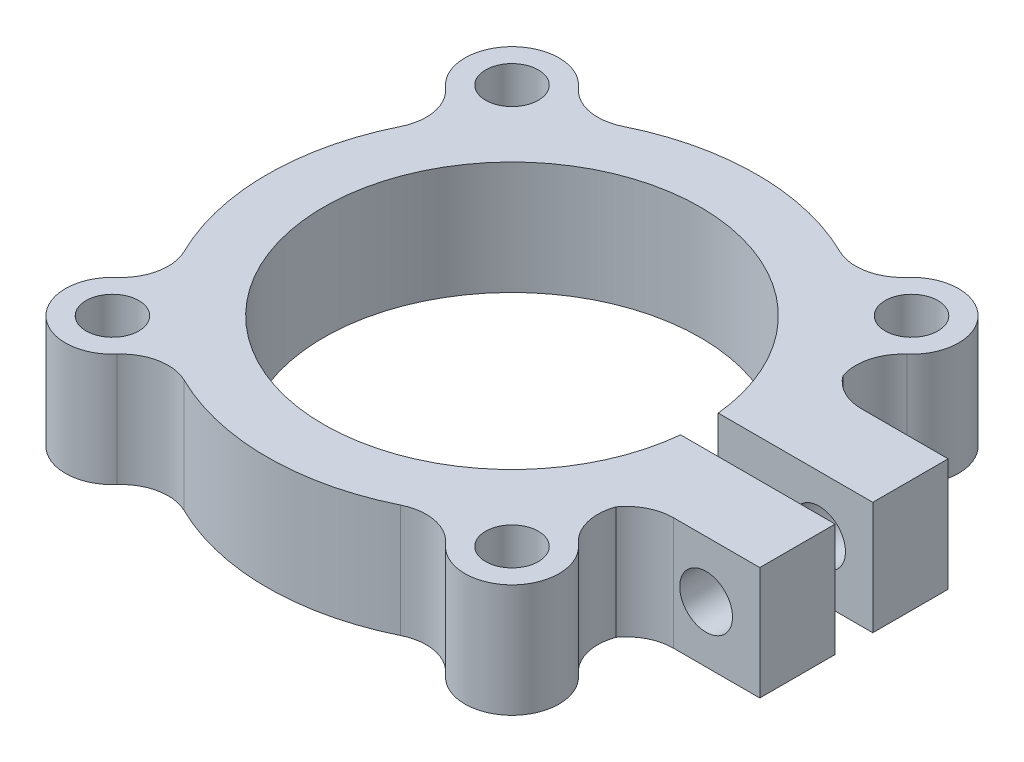
ISO-10303-21;
HEADER;
FILE_DESCRIPTION(('STEP AP214'),'2;1');
FILE_NAME('part.step','',(''),(''),'','','');
FILE_SCHEMA(('AUTOMOTIVE_DESIGN { 1 0 10303 214 1 1 1 1 }'));
ENDSEC;
DATA;
#1=APPLICATION_CONTEXT('core data for automotive mechanical design processes');
#2=APPLICATION_PROTOCOL_DEFINITION('international standard','automotive_design',2000,#1);
#3=PRODUCT_CONTEXT('',#1,'mechanical');
#4=PRODUCT('Part','Part','',(#3));
#5=PRODUCT_RELATED_PRODUCT_CATEGORY('part','',(#4));
#6=PRODUCT_DEFINITION_FORMATION('','',#4);
#7=PRODUCT_DEFINITION_CONTEXT('part definition',#1,'design');
#8=PRODUCT_DEFINITION('design','',#6,#7);
#9=PRODUCT_DEFINITION_SHAPE('','',#8);
#10=(LENGTH_UNIT() NAMED_UNIT(*) SI_UNIT(.MILLI.,.METRE.));
#11=(NAMED_UNIT(*) PLANE_ANGLE_UNIT() SI_UNIT($,.RADIAN.));
#12=(NAMED_UNIT(*) SI_UNIT($,.STERADIAN.) SOLID_ANGLE_UNIT());
#13=UNCERTAINTY_MEASURE_WITH_UNIT(LENGTH_MEASURE(1.E-05),#10,'distance_accuracy_value','');
#14=(GEOMETRIC_REPRESENTATION_CONTEXT(3) GLOBAL_UNCERTAINTY_ASSIGNED_CONTEXT((#13)) GLOBAL_UNIT_ASSIGNED_CONTEXT((#10,
#11,#12)) REPRESENTATION_CONTEXT('',''));
#15=CARTESIAN_POINT('',(0.,0.,0.));
#16=DIRECTION('',(0.,0.,1.));
#17=DIRECTION('',(1.,0.,0.));
#18=AXIS2_PLACEMENT_3D('',#15,#16,#17);
#19=CARTESIAN_POINT('',(23.0579604512541,0.,6.35));
#20=DIRECTION('',(1.,0.,0.));
#21=DIRECTION('',(0.,0.,-1.));
#22=AXIS2_PLACEMENT_3D('',#19,#20,#21);
#23=PLANE('',#22);
#24=DIRECTION('',(0.,-1.,0.));
#25=VECTOR('',#24,1.);
#26=CARTESIAN_POINT('',(23.0579604512541,7.62,-1.27));
#27=LINE('',#26,#25);
#28=CARTESIAN_POINT('',(23.0579604512541,7.62,-1.27));
#29=VERTEX_POINT('',#28);
#30=CARTESIAN_POINT('',(23.0579604512541,0.,-1.27));
#31=VERTEX_POINT('',#30);
#32=EDGE_CURVE('E736',#29,#31,#27,.T.);
#33=ORIENTED_EDGE('',*,*,#32,.T.);
#34=DIRECTION('',(0.,0.,-1.));
#35=VECTOR('',#34,1.);
#36=CARTESIAN_POINT('',(23.0579604512541,0.,6.35));
#37=LINE('',#36,#35);
#38=CARTESIAN_POINT('',(23.0579604512541,0.,-6.35));
#39=VERTEX_POINT('',#38);
#40=EDGE_CURVE('E748',#31,#39,#37,.T.);
#41=ORIENTED_EDGE('',*,*,#40,.T.);
#42=DIRECTION('',(0.,1.,0.));
#43=VECTOR('',#42,1.);
#44=CARTESIAN_POINT('',(23.0579604512541,0.,-6.35));
#45=LINE('',#44,#43);
#46=CARTESIAN_POINT('',(23.0579604512541,7.62,-6.35));
#47=VERTEX_POINT('',#46);
#48=EDGE_CURVE('E309',#39,#47,#45,.T.);
#49=ORIENTED_EDGE('',*,*,#48,.T.);
#50=DIRECTION('',(0.,0.,-1.));
#51=VECTOR('',#50,1.);
#52=CARTESIAN_POINT('',(23.0579604512541,7.62,6.35));
#53=LINE('',#52,#51);
#54=EDGE_CURVE('E222',#29,#47,#53,.T.);
#55=ORIENTED_EDGE('',*,*,#54,.F.);
#56=EDGE_LOOP('',(#33,#41,#49,#55));
#57=FACE_BOUND('',#56,.T.);
#58=ADVANCED_FACE('F34',(#57),#23,.T.);
#59=CARTESIAN_POINT('',(17.2271181571382,0.,6.35));
#60=DIRECTION('',(0.,0.,1.));
#61=DIRECTION('',(1.,0.,0.));
#62=AXIS2_PLACEMENT_3D('',#59,#60,#61);
#63=PLANE('',#62);
#64=CARTESIAN_POINT('',(19.4387931912541,3.81,6.35000000000001));
#65=DIRECTION('',(0.,0.,1.));
#66=DIRECTION('',(1.,0.,0.));
#67=AXIS2_PLACEMENT_3D('',#64,#65,#66);
#68=CIRCLE('',#67,1.77799999999998);
#69=CARTESIAN_POINT('',(21.2167931912541,3.81,6.35000000000001));
#70=VERTEX_POINT('',#69);
#71=EDGE_CURVE('E699',#70,#70,#68,.T.);
#72=ORIENTED_EDGE('',*,*,#71,.F.);
#73=EDGE_LOOP('',(#72));
#74=FACE_BOUND('',#73,.T.);
#75=DIRECTION('',(1.,0.,0.));
#76=VECTOR('',#75,1.);
#77=CARTESIAN_POINT('',(17.2271181571382,7.62,6.35));
#78=LINE('',#77,#76);
#79=CARTESIAN_POINT('',(17.2271181571382,7.62,6.35));
#80=VERTEX_POINT('',#79);
#81=CARTESIAN_POINT('',(23.0579604512541,7.62,6.35));
#82=VERTEX_POINT('',#81);
#83=EDGE_CURVE('E219',#80,#82,#78,.T.);
#84=ORIENTED_EDGE('',*,*,#83,.F.);
#85=DIRECTION('',(0.,1.,0.));
#86=VECTOR('',#85,1.);
#87=CARTESIAN_POINT('',(17.2271181571382,0.,6.35));
#88=LINE('',#87,#86);
#89=CARTESIAN_POINT('',(17.2271181571382,0.,6.35));
#90=VERTEX_POINT('',#89);
#91=EDGE_CURVE('E11',#90,#80,#88,.T.);
#92=ORIENTED_EDGE('',*,*,#91,.F.);
#93=DIRECTION('',(1.,0.,0.));
#94=VECTOR('',#93,1.);
#95=CARTESIAN_POINT('',(17.2271181571382,0.,6.35));
#96=LINE('',#95,#94);
#97=CARTESIAN_POINT('',(23.0579604512541,0.,6.35));
#98=VERTEX_POINT('',#97);
#99=EDGE_CURVE('E277',#90,#98,#96,.T.);
#100=ORIENTED_EDGE('',*,*,#99,.T.);
#101=DIRECTION('',(0.,1.,0.));
#102=VECTOR('',#101,1.);
#103=CARTESIAN_POINT('',(23.0579604512541,0.,6.35));
#104=LINE('',#103,#102);
#105=EDGE_CURVE('E133',#98,#82,#104,.T.);
#106=ORIENTED_EDGE('',*,*,#105,.T.);
#107=EDGE_LOOP('',(#84,#92,#100,#106));
#108=FACE_BOUND('',#107,.T.);
#109=ADVANCED_FACE('F36',(#74,#108),#63,.T.);
#110=CARTESIAN_POINT('',(17.2271181571382,0.,9.525));
#111=DIRECTION('',(0.,1.,0.));
#112=DIRECTION('',(0.,0.,1.));
#113=AXIS2_PLACEMENT_3D('',#110,#111,#112);
#114=CYLINDRICAL_SURFACE('',#113,3.175);
#115=CARTESIAN_POINT('',(17.2271181571382,7.62,9.525));
#116=DIRECTION('',(0.,-1.,0.));
#117=DIRECTION('',(0.,0.,-1.));
#118=AXIS2_PLACEMENT_3D('',#115,#116,#117);
#119=CIRCLE('',#118,3.175);
#120=CARTESIAN_POINT('',(14.6594904855866,7.62,7.65740444949056));
#121=VERTEX_POINT('',#120);
#122=EDGE_CURVE('E275',#121,#80,#119,.T.);
#123=ORIENTED_EDGE('',*,*,#122,.F.);
#124=DIRECTION('',(0.,1.,0.));
#125=VECTOR('',#124,1.);
#126=CARTESIAN_POINT('',(14.6594904855866,0.,7.65740444949056));
#127=LINE('',#126,#125);
#128=CARTESIAN_POINT('',(14.6594904855866,0.,7.65740444949056));
#129=VERTEX_POINT('',#128);
#130=EDGE_CURVE('E43',#129,#121,#127,.T.);
#131=ORIENTED_EDGE('',*,*,#130,.F.);
#132=CARTESIAN_POINT('',(17.2271181571382,0.,9.525));
#133=DIRECTION('',(0.,-1.,0.));
#134=DIRECTION('',(0.,0.,-1.));
#135=AXIS2_PLACEMENT_3D('',#132,#133,#134);
#136=CIRCLE('',#135,3.175);
#137=EDGE_CURVE('E209',#129,#90,#136,.T.);
#138=ORIENTED_EDGE('',*,*,#137,.T.);
#139=ORIENTED_EDGE('',*,*,#91,.T.);
#140=EDGE_LOOP('',(#123,#131,#138,#139));
#141=FACE_BOUND('',#140,.T.);
#142=ADVANCED_FACE('F318',(#141),#114,.F.);
#143=CARTESIAN_POINT('',(17.6591584825056,0.,8.69789323283239));
#144=DIRECTION('',(0.,1.,0.));
#145=DIRECTION('',(0.,0.,1.));
#146=AXIS2_PLACEMENT_3D('',#143,#144,#145);
#147=CYLINDRICAL_SURFACE('',#146,3.175);
#148=CARTESIAN_POINT('',(17.6591584825056,7.62,8.69789323283239));
#149=DIRECTION('',(0.,-1.,0.));
#150=DIRECTION('',(0.,0.,-1.));
#151=AXIS2_PLACEMENT_3D('',#148,#149,#150);
#152=CIRCLE('',#151,3.175);
#153=CARTESIAN_POINT('',(15.5647713320547,7.62,11.0841387072181));
#154=VERTEX_POINT('',#153);
#155=EDGE_CURVE('E195',#154,#121,#152,.T.);
#156=ORIENTED_EDGE('',*,*,#155,.F.);
#157=DIRECTION('',(0.,1.,0.));
#158=VECTOR('',#157,1.);
#159=CARTESIAN_POINT('',(15.5647713320547,0.,11.0841387072181));
#160=LINE('',#159,#158);
#161=CARTESIAN_POINT('',(15.5647713320547,0.,11.0841387072181));
#162=VERTEX_POINT('',#161);
#163=EDGE_CURVE('E189',#162,#154,#160,.T.);
#164=ORIENTED_EDGE('',*,*,#163,.F.);
#165=CARTESIAN_POINT('',(17.6591584825056,0.,8.69789323283239));
#166=DIRECTION('',(0.,-1.,0.));
#167=DIRECTION('',(0.,0.,-1.));
#168=AXIS2_PLACEMENT_3D('',#165,#166,#167);
#169=CIRCLE('',#168,3.175);
#170=EDGE_CURVE('E192',#162,#129,#169,.T.);
#171=ORIENTED_EDGE('',*,*,#170,.T.);
#172=ORIENTED_EDGE('',*,*,#130,.T.);
#173=EDGE_LOOP('',(#156,#164,#171,#172));
#174=FACE_BOUND('',#173,.T.);
#175=ADVANCED_FACE('F191',(#174),#147,.F.);
#176=CARTESIAN_POINT('',(13.4703841816037,0.,13.4703841816037));
#177=DIRECTION('',(0.,1.,0.));
#178=DIRECTION('',(0.,0.,1.));
#179=AXIS2_PLACEMENT_3D('',#176,#177,#178);
#180=CYLINDRICAL_SURFACE('',#179,3.17500000000001);
#181=CARTESIAN_POINT('',(13.4703841816037,7.62,13.4703841816037));
#182=DIRECTION('',(0.,1.,0.));
#183=DIRECTION('',(0.,0.,1.));
#184=AXIS2_PLACEMENT_3D('',#181,#182,#183);
#185=CIRCLE('',#184,3.17500000000001);
#186=CARTESIAN_POINT('',(11.0841387072181,7.62,15.5647713320547));
#187=VERTEX_POINT('',#186);
#188=EDGE_CURVE('E272',#187,#154,#185,.T.);
#189=ORIENTED_EDGE('',*,*,#188,.F.);
#190=DIRECTION('',(0.,1.,0.));
#191=VECTOR('',#190,1.);
#192=CARTESIAN_POINT('',(11.0841387072181,0.,15.5647713320547));
#193=LINE('',#192,#191);
#194=CARTESIAN_POINT('',(11.0841387072181,0.,15.5647713320547));
#195=VERTEX_POINT('',#194);
#196=EDGE_CURVE('E200',#195,#187,#193,.T.);
#197=ORIENTED_EDGE('',*,*,#196,.F.);
#198=CARTESIAN_POINT('',(13.4703841816037,0.,13.4703841816037));
#199=DIRECTION('',(0.,1.,0.));
#200=DIRECTION('',(0.,0.,1.));
#201=AXIS2_PLACEMENT_3D('',#198,#199,#200);
#202=CIRCLE('',#201,3.17500000000001);
#203=EDGE_CURVE('E207',#195,#162,#202,.T.);
#204=ORIENTED_EDGE('',*,*,#203,.T.);
#205=ORIENTED_EDGE('',*,*,#163,.T.);
#206=EDGE_LOOP('',(#189,#197,#204,#205));
#207=FACE_BOUND('',#206,.T.);
#208=ADVANCED_FACE('F211',(#207),#180,.T.);
#209=CARTESIAN_POINT('',(8.69789323283239,0.,17.6591584825056));
#210=DIRECTION('',(0.,1.,0.));
#211=DIRECTION('',(0.,0.,1.));
#212=AXIS2_PLACEMENT_3D('',#209,#210,#211);
#213=CYLINDRICAL_SURFACE('',#212,3.175);
#214=CARTESIAN_POINT('',(8.69789323283239,7.62,17.6591584825056));
#215=DIRECTION('',(0.,-1.,0.));
#216=DIRECTION('',(0.,0.,-1.));
#217=AXIS2_PLACEMENT_3D('',#214,#215,#216);
#218=CIRCLE('',#217,3.175);
#219=CARTESIAN_POINT('',(7.29500722753684,7.62,14.8109071143595));
#220=VERTEX_POINT('',#219);
#221=EDGE_CURVE('E269',#220,#187,#218,.T.);
#222=ORIENTED_EDGE('',*,*,#221,.F.);
#223=DIRECTION('',(0.,1.,0.));
#224=VECTOR('',#223,1.);
#225=CARTESIAN_POINT('',(7.29500722753684,0.,14.8109071143595));
#226=LINE('',#225,#224);
#227=CARTESIAN_POINT('',(7.29500722753684,0.,14.8109071143595));
#228=VERTEX_POINT('',#227);
#229=EDGE_CURVE('E281',#228,#220,#226,.T.);
#230=ORIENTED_EDGE('',*,*,#229,.F.);
#231=CARTESIAN_POINT('',(8.69789323283239,0.,17.6591584825056));
#232=DIRECTION('',(0.,-1.,0.));
#233=DIRECTION('',(0.,0.,-1.));
#234=AXIS2_PLACEMENT_3D('',#231,#232,#233);
#235=CIRCLE('',#234,3.175);
#236=EDGE_CURVE('E212',#228,#195,#235,.T.);
#237=ORIENTED_EDGE('',*,*,#236,.T.);
#238=ORIENTED_EDGE('',*,*,#196,.T.);
#239=EDGE_LOOP('',(#222,#230,#237,#238));
#240=FACE_BOUND('',#239,.T.);
#241=ADVANCED_FACE('F399',(#240),#213,.F.);
#242=CARTESIAN_POINT('',(0.,0.,0.));
#243=DIRECTION('',(0.,1.,0.));
#244=DIRECTION('',(0.,0.,1.));
#245=AXIS2_PLACEMENT_3D('',#242,#243,#244);
#246=CYLINDRICAL_SURFACE('',#245,16.51);
#247=CARTESIAN_POINT('',(0.,7.62,0.));
#248=DIRECTION('',(0.,1.,0.));
#249=DIRECTION('',(0.,0.,1.));
#250=AXIS2_PLACEMENT_3D('',#247,#248,#249);
#251=CIRCLE('',#250,16.51);
#252=CARTESIAN_POINT('',(-7.29500722753683,7.62,14.8109071143595));
#253=VERTEX_POINT('',#252);
#254=EDGE_CURVE('E266',#253,#220,#251,.T.);
#255=ORIENTED_EDGE('',*,*,#254,.F.);
#256=DIRECTION('',(0.,1.,0.));
#257=VECTOR('',#256,1.);
#258=CARTESIAN_POINT('',(-7.29500722753683,0.,14.8109071143595));
#259=LINE('',#258,#257);
#260=CARTESIAN_POINT('',(-7.29500722753683,0.,14.8109071143595));
#261=VERTEX_POINT('',#260);
#262=EDGE_CURVE('E283',#261,#253,#259,.T.);
#263=ORIENTED_EDGE('',*,*,#262,.F.);
#264=CARTESIAN_POINT('',(0.,0.,0.));
#265=DIRECTION('',(0.,1.,0.));
#266=DIRECTION('',(0.,0.,1.));
#267=AXIS2_PLACEMENT_3D('',#264,#265,#266);
#268=CIRCLE('',#267,16.51);
#269=EDGE_CURVE('E214',#261,#228,#268,.T.);
#270=ORIENTED_EDGE('',*,*,#269,.T.);
#271=ORIENTED_EDGE('',*,*,#229,.T.);
#272=EDGE_LOOP('',(#255,#263,#270,#271));
#273=FACE_BOUND('',#272,.T.);
#274=ADVANCED_FACE('F395',(#273),#246,.T.);
#275=CARTESIAN_POINT('',(-8.69789323283238,0.,17.6591584825056));
#276=DIRECTION('',(0.,1.,0.));
#277=DIRECTION('',(0.,0.,1.));
#278=AXIS2_PLACEMENT_3D('',#275,#276,#277);
#279=CYLINDRICAL_SURFACE('',#278,3.175);
#280=CARTESIAN_POINT('',(-8.69789323283238,7.62,17.6591584825056));
#281=DIRECTION('',(0.,-1.,0.));
#282=DIRECTION('',(0.,0.,-1.));
#283=AXIS2_PLACEMENT_3D('',#280,#281,#282);
#284=CIRCLE('',#283,3.175);
#285=CARTESIAN_POINT('',(-11.0841387072181,7.62,15.5647713320547));
#286=VERTEX_POINT('',#285);
#287=EDGE_CURVE('E263',#286,#253,#284,.T.);
#288=ORIENTED_EDGE('',*,*,#287,.F.);
#289=DIRECTION('',(0.,1.,0.));
#290=VECTOR('',#289,1.);
#291=CARTESIAN_POINT('',(-11.0841387072181,0.,15.5647713320547));
#292=LINE('',#291,#290);
#293=CARTESIAN_POINT('',(-11.0841387072181,0.,15.5647713320547));
#294=VERTEX_POINT('',#293);
#295=EDGE_CURVE('E285',#294,#286,#292,.T.);
#296=ORIENTED_EDGE('',*,*,#295,.F.);
#297=CARTESIAN_POINT('',(-8.69789323283238,0.,17.6591584825056));
#298=DIRECTION('',(0.,-1.,0.));
#299=DIRECTION('',(0.,0.,-1.));
#300=AXIS2_PLACEMENT_3D('',#297,#298,#299);
#301=CIRCLE('',#300,3.175);
#302=EDGE_CURVE('E787',#294,#261,#301,.T.);
#303=ORIENTED_EDGE('',*,*,#302,.T.);
#304=ORIENTED_EDGE('',*,*,#262,.T.);
#305=EDGE_LOOP('',(#288,#296,#303,#304));
#306=FACE_BOUND('',#305,.T.);
#307=ADVANCED_FACE('F391',(#306),#279,.F.);
#308=CARTESIAN_POINT('',(-13.4703841816037,0.,13.4703841816037));
#309=DIRECTION('',(0.,1.,0.));
#310=DIRECTION('',(0.,0.,1.));
#311=AXIS2_PLACEMENT_3D('',#308,#309,#310);
#312=CYLINDRICAL_SURFACE('',#311,3.17500000000001);
#313=CARTESIAN_POINT('',(-13.4703841816037,7.62,13.4703841816037));
#314=DIRECTION('',(0.,1.,0.));
#315=DIRECTION('',(0.,0.,1.));
#316=AXIS2_PLACEMENT_3D('',#313,#314,#315);
#317=CIRCLE('',#316,3.17500000000001);
#318=CARTESIAN_POINT('',(-15.5647713320547,7.62,11.0841387072181));
#319=VERTEX_POINT('',#318);
#320=EDGE_CURVE('E260',#319,#286,#317,.T.);
#321=ORIENTED_EDGE('',*,*,#320,.F.);
#322=DIRECTION('',(0.,1.,0.));
#323=VECTOR('',#322,1.);
#324=CARTESIAN_POINT('',(-15.5647713320547,0.,11.0841387072181));
#325=LINE('',#324,#323);
#326=CARTESIAN_POINT('',(-15.5647713320547,0.,11.0841387072181));
#327=VERTEX_POINT('',#326);
#328=EDGE_CURVE('E287',#327,#319,#325,.T.);
#329=ORIENTED_EDGE('',*,*,#328,.F.);
#330=CARTESIAN_POINT('',(-13.4703841816037,0.,13.4703841816037));
#331=DIRECTION('',(0.,1.,0.));
#332=DIRECTION('',(0.,0.,1.));
#333=AXIS2_PLACEMENT_3D('',#330,#331,#332);
#334=CIRCLE('',#333,3.17500000000001);
#335=EDGE_CURVE('E784',#327,#294,#334,.T.);
#336=ORIENTED_EDGE('',*,*,#335,.T.);
#337=ORIENTED_EDGE('',*,*,#295,.T.);
#338=EDGE_LOOP('',(#321,#329,#336,#337));
#339=FACE_BOUND('',#338,.T.);
#340=ADVANCED_FACE('F387',(#339),#312,.T.);
#341=CARTESIAN_POINT('',(-17.6591584825056,0.,8.6978932328324));
#342=DIRECTION('',(0.,1.,0.));
#343=DIRECTION('',(0.,0.,1.));
#344=AXIS2_PLACEMENT_3D('',#341,#342,#343);
#345=CYLINDRICAL_SURFACE('',#344,3.175);
#346=CARTESIAN_POINT('',(-17.6591584825056,7.62,8.6978932328324));
#347=DIRECTION('',(0.,-1.,0.));
#348=DIRECTION('',(0.,0.,-1.));
#349=AXIS2_PLACEMENT_3D('',#346,#347,#348);
#350=CIRCLE('',#349,3.175);
#351=CARTESIAN_POINT('',(-14.8109071143595,7.62,7.29500722753685));
#352=VERTEX_POINT('',#351);
#353=EDGE_CURVE('E257',#352,#319,#350,.T.);
#354=ORIENTED_EDGE('',*,*,#353,.F.);
#355=DIRECTION('',(0.,1.,0.));
#356=VECTOR('',#355,1.);
#357=CARTESIAN_POINT('',(-14.8109071143595,0.,7.29500722753685));
#358=LINE('',#357,#356);
#359=CARTESIAN_POINT('',(-14.8109071143595,0.,7.29500722753685));
#360=VERTEX_POINT('',#359);
#361=EDGE_CURVE('E289',#360,#352,#358,.T.);
#362=ORIENTED_EDGE('',*,*,#361,.F.);
#363=CARTESIAN_POINT('',(-17.6591584825056,0.,8.6978932328324));
#364=DIRECTION('',(0.,-1.,0.));
#365=DIRECTION('',(0.,0.,-1.));
#366=AXIS2_PLACEMENT_3D('',#363,#364,#365);
#367=CIRCLE('',#366,3.175);
#368=EDGE_CURVE('E781',#360,#327,#367,.T.);
#369=ORIENTED_EDGE('',*,*,#368,.T.);
#370=ORIENTED_EDGE('',*,*,#328,.T.);
#371=EDGE_LOOP('',(#354,#362,#369,#370));
#372=FACE_BOUND('',#371,.T.);
#373=ADVANCED_FACE('F383',(#372),#345,.F.);
#374=CARTESIAN_POINT('',(0.,0.,0.));
#375=DIRECTION('',(0.,1.,0.));
#376=DIRECTION('',(0.,0.,1.));
#377=AXIS2_PLACEMENT_3D('',#374,#375,#376);
#378=CYLINDRICAL_SURFACE('',#377,16.51);
#379=CARTESIAN_POINT('',(0.,7.62,0.));
#380=DIRECTION('',(0.,1.,0.));
#381=DIRECTION('',(0.,0.,1.));
#382=AXIS2_PLACEMENT_3D('',#379,#380,#381);
#383=CIRCLE('',#382,16.51);
#384=CARTESIAN_POINT('',(-14.8109071143595,7.62,-7.29500722753683));
#385=VERTEX_POINT('',#384);
#386=EDGE_CURVE('E254',#385,#352,#383,.T.);
#387=ORIENTED_EDGE('',*,*,#386,.F.);
#388=DIRECTION('',(0.,1.,0.));
#389=VECTOR('',#388,1.);
#390=CARTESIAN_POINT('',(-14.8109071143595,0.,-7.29500722753683));
#391=LINE('',#390,#389);
#392=CARTESIAN_POINT('',(-14.8109071143595,0.,-7.29500722753683));
#393=VERTEX_POINT('',#392);
#394=EDGE_CURVE('E291',#393,#385,#391,.T.);
#395=ORIENTED_EDGE('',*,*,#394,.F.);
#396=CARTESIAN_POINT('',(0.,0.,0.));
#397=DIRECTION('',(0.,1.,0.));
#398=DIRECTION('',(0.,0.,1.));
#399=AXIS2_PLACEMENT_3D('',#396,#397,#398);
#400=CIRCLE('',#399,16.51);
#401=EDGE_CURVE('E778',#393,#360,#400,.T.);
#402=ORIENTED_EDGE('',*,*,#401,.T.);
#403=ORIENTED_EDGE('',*,*,#361,.T.);
#404=EDGE_LOOP('',(#387,#395,#402,#403));
#405=FACE_BOUND('',#404,.T.);
#406=ADVANCED_FACE('F379',(#405),#378,.T.);
#407=CARTESIAN_POINT('',(-17.6591584825056,0.,-8.69789323283237));
#408=DIRECTION('',(0.,1.,0.));
#409=DIRECTION('',(0.,0.,1.));
#410=AXIS2_PLACEMENT_3D('',#407,#408,#409);
#411=CYLINDRICAL_SURFACE('',#410,3.175);
#412=CARTESIAN_POINT('',(-17.6591584825056,7.62,-8.69789323283237));
#413=DIRECTION('',(0.,-1.,0.));
#414=DIRECTION('',(0.,0.,-1.));
#415=AXIS2_PLACEMENT_3D('',#412,#413,#414);
#416=CIRCLE('',#415,3.175);
#417=CARTESIAN_POINT('',(-15.5647713320547,7.62,-11.084138707218));
#418=VERTEX_POINT('',#417);
#419=EDGE_CURVE('E251',#418,#385,#416,.T.);
#420=ORIENTED_EDGE('',*,*,#419,.F.);
#421=DIRECTION('',(0.,1.,0.));
#422=VECTOR('',#421,1.);
#423=CARTESIAN_POINT('',(-15.5647713320547,0.,-11.084138707218));
#424=LINE('',#423,#422);
#425=CARTESIAN_POINT('',(-15.5647713320547,0.,-11.084138707218));
#426=VERTEX_POINT('',#425);
#427=EDGE_CURVE('E293',#426,#418,#424,.T.);
#428=ORIENTED_EDGE('',*,*,#427,.F.);
#429=CARTESIAN_POINT('',(-17.6591584825056,0.,-8.69789323283237));
#430=DIRECTION('',(0.,-1.,0.));
#431=DIRECTION('',(0.,0.,-1.));
#432=AXIS2_PLACEMENT_3D('',#429,#430,#431);
#433=CIRCLE('',#432,3.175);
#434=EDGE_CURVE('E775',#426,#393,#433,.T.);
#435=ORIENTED_EDGE('',*,*,#434,.T.);
#436=ORIENTED_EDGE('',*,*,#394,.T.);
#437=EDGE_LOOP('',(#420,#428,#435,#436));
#438=FACE_BOUND('',#437,.T.);
#439=ADVANCED_FACE('F375',(#438),#411,.F.);
#440=CARTESIAN_POINT('',(-13.4703841816037,0.,-13.4703841816037));
#441=DIRECTION('',(0.,1.,0.));
#442=DIRECTION('',(0.,0.,1.));
#443=AXIS2_PLACEMENT_3D('',#440,#441,#442);
#444=CYLINDRICAL_SURFACE('',#443,3.17500000000001);
#445=CARTESIAN_POINT('',(-13.4703841816037,7.62,-13.4703841816037));
#446=DIRECTION('',(0.,1.,0.));
#447=DIRECTION('',(0.,0.,1.));
#448=AXIS2_PLACEMENT_3D('',#445,#446,#447);
#449=CIRCLE('',#448,3.17500000000001);
#450=CARTESIAN_POINT('',(-11.0841387072181,7.62,-15.5647713320546));
#451=VERTEX_POINT('',#450);
#452=EDGE_CURVE('E248',#451,#418,#449,.T.);
#453=ORIENTED_EDGE('',*,*,#452,.F.);
#454=DIRECTION('',(0.,1.,0.));
#455=VECTOR('',#454,1.);
#456=CARTESIAN_POINT('',(-11.0841387072181,0.,-15.5647713320546));
#457=LINE('',#456,#455);
#458=CARTESIAN_POINT('',(-11.0841387072181,0.,-15.5647713320546));
#459=VERTEX_POINT('',#458);
#460=EDGE_CURVE('E295',#459,#451,#457,.T.);
#461=ORIENTED_EDGE('',*,*,#460,.F.);
#462=CARTESIAN_POINT('',(-13.4703841816037,0.,-13.4703841816037));
#463=DIRECTION('',(0.,1.,0.));
#464=DIRECTION('',(0.,0.,1.));
#465=AXIS2_PLACEMENT_3D('',#462,#463,#464);
#466=CIRCLE('',#465,3.17500000000001);
#467=EDGE_CURVE('E772',#459,#426,#466,.T.);
#468=ORIENTED_EDGE('',*,*,#467,.T.);
#469=ORIENTED_EDGE('',*,*,#427,.T.);
#470=EDGE_LOOP('',(#453,#461,#468,#469));
#471=FACE_BOUND('',#470,.T.);
#472=ADVANCED_FACE('F371',(#471),#444,.T.);
#473=CARTESIAN_POINT('',(-8.6978932328324,0.,-17.6591584825056));
#474=DIRECTION('',(0.,1.,0.));
#475=DIRECTION('',(0.,0.,1.));
#476=AXIS2_PLACEMENT_3D('',#473,#474,#475);
#477=CYLINDRICAL_SURFACE('',#476,3.175);
#478=CARTESIAN_POINT('',(-8.6978932328324,7.62,-17.6591584825056));
#479=DIRECTION('',(0.,-1.,0.));
#480=DIRECTION('',(0.,0.,-1.));
#481=AXIS2_PLACEMENT_3D('',#478,#479,#480);
#482=CIRCLE('',#481,3.175);
#483=CARTESIAN_POINT('',(-7.29500722753685,7.62,-14.8109071143595));
#484=VERTEX_POINT('',#483);
#485=EDGE_CURVE('E245',#484,#451,#482,.T.);
#486=ORIENTED_EDGE('',*,*,#485,.F.);
#487=DIRECTION('',(0.,1.,0.));
#488=VECTOR('',#487,1.);
#489=CARTESIAN_POINT('',(-7.29500722753685,0.,-14.8109071143595));
#490=LINE('',#489,#488);
#491=CARTESIAN_POINT('',(-7.29500722753685,0.,-14.8109071143595));
#492=VERTEX_POINT('',#491);
#493=EDGE_CURVE('E297',#492,#484,#490,.T.);
#494=ORIENTED_EDGE('',*,*,#493,.F.);
#495=CARTESIAN_POINT('',(-8.6978932328324,0.,-17.6591584825056));
#496=DIRECTION('',(0.,-1.,0.));
#497=DIRECTION('',(0.,0.,-1.));
#498=AXIS2_PLACEMENT_3D('',#495,#496,#497);
#499=CIRCLE('',#498,3.175);
#500=EDGE_CURVE('E769',#492,#459,#499,.T.);
#501=ORIENTED_EDGE('',*,*,#500,.T.);
#502=ORIENTED_EDGE('',*,*,#460,.T.);
#503=EDGE_LOOP('',(#486,#494,#501,#502));
#504=FACE_BOUND('',#503,.T.);
#505=ADVANCED_FACE('F367',(#504),#477,.F.);
#506=CARTESIAN_POINT('',(0.,0.,0.));
#507=DIRECTION('',(0.,1.,0.));
#508=DIRECTION('',(0.,0.,1.));
#509=AXIS2_PLACEMENT_3D('',#506,#507,#508);
#510=CYLINDRICAL_SURFACE('',#509,16.51);
#511=CARTESIAN_POINT('',(0.,7.62,0.));
#512=DIRECTION('',(0.,1.,0.));
#513=DIRECTION('',(0.,0.,1.));
#514=AXIS2_PLACEMENT_3D('',#511,#512,#513);
#515=CIRCLE('',#514,16.51);
#516=CARTESIAN_POINT('',(7.29500722753682,7.62,-14.8109071143595));
#517=VERTEX_POINT('',#516);
#518=EDGE_CURVE('E242',#517,#484,#515,.T.);
#519=ORIENTED_EDGE('',*,*,#518,.F.);
#520=DIRECTION('',(0.,1.,0.));
#521=VECTOR('',#520,1.);
#522=CARTESIAN_POINT('',(7.29500722753682,0.,-14.8109071143595));
#523=LINE('',#522,#521);
#524=CARTESIAN_POINT('',(7.29500722753682,0.,-14.8109071143595));
#525=VERTEX_POINT('',#524);
#526=EDGE_CURVE('E299',#525,#517,#523,.T.);
#527=ORIENTED_EDGE('',*,*,#526,.F.);
#528=CARTESIAN_POINT('',(0.,0.,0.));
#529=DIRECTION('',(0.,1.,0.));
#530=DIRECTION('',(0.,0.,1.));
#531=AXIS2_PLACEMENT_3D('',#528,#529,#530);
#532=CIRCLE('',#531,16.51);
#533=EDGE_CURVE('E766',#525,#492,#532,.T.);
#534=ORIENTED_EDGE('',*,*,#533,.T.);
#535=ORIENTED_EDGE('',*,*,#493,.T.);
#536=EDGE_LOOP('',(#519,#527,#534,#535));
#537=FACE_BOUND('',#536,.T.);
#538=ADVANCED_FACE('F363',(#537),#510,.T.);
#539=CARTESIAN_POINT('',(8.69789323283236,0.,-17.6591584825056));
#540=DIRECTION('',(0.,1.,0.));
#541=DIRECTION('',(0.,0.,1.));
#542=AXIS2_PLACEMENT_3D('',#539,#540,#541);
#543=CYLINDRICAL_SURFACE('',#542,3.175);
#544=CARTESIAN_POINT('',(8.69789323283236,7.62,-17.6591584825056));
#545=DIRECTION('',(0.,-1.,0.));
#546=DIRECTION('',(0.,0.,-1.));
#547=AXIS2_PLACEMENT_3D('',#544,#545,#546);
#548=CIRCLE('',#547,3.175);
#549=CARTESIAN_POINT('',(11.084138707218,7.62,-15.5647713320547));
#550=VERTEX_POINT('',#549);
#551=EDGE_CURVE('E239',#550,#517,#548,.T.);
#552=ORIENTED_EDGE('',*,*,#551,.F.);
#553=DIRECTION('',(0.,1.,0.));
#554=VECTOR('',#553,1.);
#555=CARTESIAN_POINT('',(11.084138707218,0.,-15.5647713320547));
#556=LINE('',#555,#554);
#557=CARTESIAN_POINT('',(11.084138707218,0.,-15.5647713320547));
#558=VERTEX_POINT('',#557);
#559=EDGE_CURVE('E301',#558,#550,#556,.T.);
#560=ORIENTED_EDGE('',*,*,#559,.F.);
#561=CARTESIAN_POINT('',(8.69789323283236,0.,-17.6591584825056));
#562=DIRECTION('',(0.,-1.,0.));
#563=DIRECTION('',(0.,0.,-1.));
#564=AXIS2_PLACEMENT_3D('',#561,#562,#563);
#565=CIRCLE('',#564,3.175);
#566=EDGE_CURVE('E763',#558,#525,#565,.T.);
#567=ORIENTED_EDGE('',*,*,#566,.T.);
#568=ORIENTED_EDGE('',*,*,#526,.T.);
#569=EDGE_LOOP('',(#552,#560,#567,#568));
#570=FACE_BOUND('',#569,.T.);
#571=ADVANCED_FACE('F359',(#570),#543,.F.);
#572=CARTESIAN_POINT('',(13.4703841816037,0.,-13.4703841816038));
#573=DIRECTION('',(0.,1.,0.));
#574=DIRECTION('',(0.,0.,1.));
#575=AXIS2_PLACEMENT_3D('',#572,#573,#574);
#576=CYLINDRICAL_SURFACE('',#575,3.17500000000001);
#577=CARTESIAN_POINT('',(13.4703841816037,7.62,-13.4703841816038));
#578=DIRECTION('',(0.,1.,0.));
#579=DIRECTION('',(0.,0.,1.));
#580=AXIS2_PLACEMENT_3D('',#577,#578,#579);
#581=CIRCLE('',#580,3.17500000000001);
#582=CARTESIAN_POINT('',(15.5647713320546,7.62,-11.0841387072181));
#583=VERTEX_POINT('',#582);
#584=EDGE_CURVE('E236',#583,#550,#581,.T.);
#585=ORIENTED_EDGE('',*,*,#584,.F.);
#586=DIRECTION('',(0.,1.,0.));
#587=VECTOR('',#586,1.);
#588=CARTESIAN_POINT('',(15.5647713320546,0.,-11.0841387072181));
#589=LINE('',#588,#587);
#590=CARTESIAN_POINT('',(15.5647713320546,0.,-11.0841387072181));
#591=VERTEX_POINT('',#590);
#592=EDGE_CURVE('E303',#591,#583,#589,.T.);
#593=ORIENTED_EDGE('',*,*,#592,.F.);
#594=CARTESIAN_POINT('',(13.4703841816037,0.,-13.4703841816038));
#595=DIRECTION('',(0.,1.,0.));
#596=DIRECTION('',(0.,0.,1.));
#597=AXIS2_PLACEMENT_3D('',#594,#595,#596);
#598=CIRCLE('',#597,3.17500000000001);
#599=EDGE_CURVE('E760',#591,#558,#598,.T.);
#600=ORIENTED_EDGE('',*,*,#599,.T.);
#601=ORIENTED_EDGE('',*,*,#559,.T.);
#602=EDGE_LOOP('',(#585,#593,#600,#601));
#603=FACE_BOUND('',#602,.T.);
#604=ADVANCED_FACE('F355',(#603),#576,.T.);
#605=CARTESIAN_POINT('',(17.6591584825056,0.,-8.69789323283242));
#606=DIRECTION('',(0.,1.,0.));
#607=DIRECTION('',(0.,0.,1.));
#608=AXIS2_PLACEMENT_3D('',#605,#606,#607);
#609=CYLINDRICAL_SURFACE('',#608,3.175);
#610=CARTESIAN_POINT('',(17.6591584825056,7.62,-8.69789323283242));
#611=DIRECTION('',(0.,-1.,0.));
#612=DIRECTION('',(0.,0.,-1.));
#613=AXIS2_PLACEMENT_3D('',#610,#611,#612);
#614=CIRCLE('',#613,3.175);
#615=CARTESIAN_POINT('',(14.6594904855866,7.62,-7.65740444949056));
#616=VERTEX_POINT('',#615);
#617=EDGE_CURVE('E233',#616,#583,#614,.T.);
#618=ORIENTED_EDGE('',*,*,#617,.F.);
#619=DIRECTION('',(0.,1.,0.));
#620=VECTOR('',#619,1.);
#621=CARTESIAN_POINT('',(14.6594904855866,0.,-7.65740444949056));
#622=LINE('',#621,#620);
#623=CARTESIAN_POINT('',(14.6594904855866,0.,-7.65740444949056));
#624=VERTEX_POINT('',#623);
#625=EDGE_CURVE('E305',#624,#616,#622,.T.);
#626=ORIENTED_EDGE('',*,*,#625,.F.);
#627=CARTESIAN_POINT('',(17.6591584825056,0.,-8.69789323283242));
#628=DIRECTION('',(0.,-1.,0.));
#629=DIRECTION('',(0.,0.,-1.));
#630=AXIS2_PLACEMENT_3D('',#627,#628,#629);
#631=CIRCLE('',#630,3.175);
#632=EDGE_CURVE('E757',#624,#591,#631,.T.);
#633=ORIENTED_EDGE('',*,*,#632,.T.);
#634=ORIENTED_EDGE('',*,*,#592,.T.);
#635=EDGE_LOOP('',(#618,#626,#633,#634));
#636=FACE_BOUND('',#635,.T.);
#637=ADVANCED_FACE('F347',(#636),#609,.F.);
#638=CARTESIAN_POINT('',(17.2271181571382,0.,-9.525));
#639=DIRECTION('',(0.,1.,0.));
#640=DIRECTION('',(0.,0.,1.));
#641=AXIS2_PLACEMENT_3D('',#638,#639,#640);
#642=CYLINDRICAL_SURFACE('',#641,3.175);
#643=CARTESIAN_POINT('',(17.2271181571382,7.62,-9.525));
#644=DIRECTION('',(0.,-1.,0.));
#645=DIRECTION('',(0.,0.,-1.));
#646=AXIS2_PLACEMENT_3D('',#643,#644,#645);
#647=CIRCLE('',#646,3.175);
#648=CARTESIAN_POINT('',(17.2271181571382,7.62,-6.35));
#649=VERTEX_POINT('',#648);
#650=EDGE_CURVE('E230',#649,#616,#647,.T.);
#651=ORIENTED_EDGE('',*,*,#650,.F.);
#652=DIRECTION('',(0.,1.,0.));
#653=VECTOR('',#652,1.);
#654=CARTESIAN_POINT('',(17.2271181571382,0.,-6.35));
#655=LINE('',#654,#653);
#656=CARTESIAN_POINT('',(17.2271181571382,0.,-6.35));
#657=VERTEX_POINT('',#656);
#658=EDGE_CURVE('E307',#657,#649,#655,.T.);
#659=ORIENTED_EDGE('',*,*,#658,.F.);
#660=CARTESIAN_POINT('',(17.2271181571382,0.,-9.525));
#661=DIRECTION('',(0.,-1.,0.));
#662=DIRECTION('',(0.,0.,-1.));
#663=AXIS2_PLACEMENT_3D('',#660,#661,#662);
#664=CIRCLE('',#663,3.175);
#665=EDGE_CURVE('E754',#657,#624,#664,.T.);
#666=ORIENTED_EDGE('',*,*,#665,.T.);
#667=ORIENTED_EDGE('',*,*,#625,.T.);
#668=EDGE_LOOP('',(#651,#659,#666,#667));
#669=FACE_BOUND('',#668,.T.);
#670=ADVANCED_FACE('F342',(#669),#642,.F.);
#671=CARTESIAN_POINT('',(23.0579604512541,0.,-6.35));
#672=DIRECTION('',(0.,0.,-1.));
#673=DIRECTION('',(-1.,0.,0.));
#674=AXIS2_PLACEMENT_3D('',#671,#672,#673);
#675=PLANE('',#674);
#676=CARTESIAN_POINT('',(19.4387931912541,3.81,-6.35));
#677=DIRECTION('',(0.,0.,-1.));
#678=DIRECTION('',(-1.,0.,0.));
#679=AXIS2_PLACEMENT_3D('',#676,#677,#678);
#680=CIRCLE('',#679,1.77799999999998);
#681=CARTESIAN_POINT('',(17.6607931912541,3.81,-6.35));
#682=VERTEX_POINT('',#681);
#683=EDGE_CURVE('E691',#682,#682,#680,.T.);
#684=ORIENTED_EDGE('',*,*,#683,.F.);
#685=EDGE_LOOP('',(#684));
#686=FACE_BOUND('',#685,.T.);
#687=DIRECTION('',(-1.,0.,0.));
#688=VECTOR('',#687,1.);
#689=CARTESIAN_POINT('',(23.0579604512541,7.62,-6.35));
#690=LINE('',#689,#688);
#691=EDGE_CURVE('E227',#47,#649,#690,.T.);
#692=ORIENTED_EDGE('',*,*,#691,.F.);
#693=ORIENTED_EDGE('',*,*,#48,.F.);
#694=DIRECTION('',(-1.,0.,0.));
#695=VECTOR('',#694,1.);
#696=CARTESIAN_POINT('',(23.0579604512541,0.,-6.35));
#697=LINE('',#696,#695);
#698=EDGE_CURVE('E751',#39,#657,#697,.T.);
#699=ORIENTED_EDGE('',*,*,#698,.T.);
#700=ORIENTED_EDGE('',*,*,#658,.T.);
#701=EDGE_LOOP('',(#692,#693,#699,#700));
#702=FACE_BOUND('',#701,.T.);
#703=ADVANCED_FACE('F335',(#686,#702),#675,.T.);
#704=DIRECTION('',(0.,-1.,0.));
#705=VECTOR('',#704,1.);
#706=CARTESIAN_POINT('',(23.0579604512541,7.62,1.27));
#707=LINE('',#706,#705);
#708=CARTESIAN_POINT('',(23.0579604512541,7.62,1.27));
#709=VERTEX_POINT('',#708);
#710=CARTESIAN_POINT('',(23.0579604512541,0.,1.27));
#711=VERTEX_POINT('',#710);
#712=EDGE_CURVE('E314',#709,#711,#707,.T.);
#713=ORIENTED_EDGE('',*,*,#712,.F.);
#714=EDGE_CURVE('E224',#82,#709,#53,.T.);
#715=ORIENTED_EDGE('',*,*,#714,.F.);
#716=ORIENTED_EDGE('',*,*,#105,.F.);
#717=EDGE_CURVE('E749',#98,#711,#37,.T.);
#718=ORIENTED_EDGE('',*,*,#717,.T.);
#719=EDGE_LOOP('',(#713,#715,#716,#718));
#720=FACE_BOUND('',#719,.T.);
#721=ADVANCED_FACE('F312',(#720),#23,.T.);
#722=CARTESIAN_POINT('',(17.2271181571382,0.,-9.525));
#723=DIRECTION('',(0.,-1.,0.));
#724=DIRECTION('',(0.,0.,-1.));
#725=AXIS2_PLACEMENT_3D('',#722,#723,#724);
#726=PLANE('',#725);
#727=CARTESIAN_POINT('',(13.4703841816039,0.,13.4703841816035));
#728=DIRECTION('',(0.,1.,0.));
#729=DIRECTION('',(0.,0.,1.));
#730=AXIS2_PLACEMENT_3D('',#727,#728,#729);
#731=CIRCLE('',#730,1.77799999999998);
#732=CARTESIAN_POINT('',(13.4703841816039,0.,15.2483841816035));
#733=VERTEX_POINT('',#732);
#734=EDGE_CURVE('E704',#733,#733,#731,.T.);
#735=ORIENTED_EDGE('',*,*,#734,.T.);
#736=EDGE_LOOP('',(#735));
#737=FACE_BOUND('',#736,.T.);
#738=CARTESIAN_POINT('',(-13.4703841816036,0.,13.4703841816037));
#739=DIRECTION('',(0.,1.,0.));
#740=DIRECTION('',(0.,0.,1.));
#741=AXIS2_PLACEMENT_3D('',#738,#739,#740);
#742=CIRCLE('',#741,1.77799999999998);
#743=CARTESIAN_POINT('',(-13.4703841816036,0.,15.2483841816037));
#744=VERTEX_POINT('',#743);
#745=EDGE_CURVE('E710',#744,#744,#742,.T.);
#746=ORIENTED_EDGE('',*,*,#745,.T.);
#747=EDGE_LOOP('',(#746));
#748=FACE_BOUND('',#747,.T.);
#749=CARTESIAN_POINT('',(-13.4703841816038,0.,-13.4703841816036));
#750=DIRECTION('',(0.,1.,0.));
#751=DIRECTION('',(0.,0.,1.));
#752=AXIS2_PLACEMENT_3D('',#749,#750,#751);
#753=CIRCLE('',#752,1.77799999999998);
#754=CARTESIAN_POINT('',(-13.4703841816038,0.,-11.6923841816036));
#755=VERTEX_POINT('',#754);
#756=EDGE_CURVE('E716',#755,#755,#753,.T.);
#757=ORIENTED_EDGE('',*,*,#756,.T.);
#758=EDGE_LOOP('',(#757));
#759=FACE_BOUND('',#758,.T.);
#760=CARTESIAN_POINT('',(13.4703841816036,0.,-13.4703841816037));
#761=DIRECTION('',(0.,1.,0.));
#762=DIRECTION('',(0.,0.,1.));
#763=AXIS2_PLACEMENT_3D('',#760,#761,#762);
#764=CIRCLE('',#763,1.77799999999998);
#765=CARTESIAN_POINT('',(13.4703841816036,0.,-11.6923841816038));
#766=VERTEX_POINT('',#765);
#767=EDGE_CURVE('E722',#766,#766,#764,.T.);
#768=ORIENTED_EDGE('',*,*,#767,.T.);
#769=EDGE_LOOP('',(#768));
#770=FACE_BOUND('',#769,.T.);
#771=CARTESIAN_POINT('',(0.,0.,0.));
#772=DIRECTION('',(0.,-1.,0.));
#773=DIRECTION('',(0.,0.,-1.));
#774=AXIS2_PLACEMENT_3D('',#771,#772,#773);
#775=CIRCLE('',#774,12.7);
#776=CARTESIAN_POINT('',(12.6363404512541,0.,1.27));
#777=VERTEX_POINT('',#776);
#778=CARTESIAN_POINT('',(12.6363404512541,0.,-1.27));
#779=VERTEX_POINT('',#778);
#780=EDGE_CURVE('E725',#777,#779,#775,.T.);
#781=ORIENTED_EDGE('',*,*,#780,.F.);
#782=DIRECTION('',(-1.,0.,0.));
#783=VECTOR('',#782,1.);
#784=CARTESIAN_POINT('',(23.0579604512541,0.,1.27));
#785=LINE('',#784,#783);
#786=EDGE_CURVE('E734',#711,#777,#785,.T.);
#787=ORIENTED_EDGE('',*,*,#786,.F.);
#788=ORIENTED_EDGE('',*,*,#717,.F.);
#789=ORIENTED_EDGE('',*,*,#99,.F.);
#790=ORIENTED_EDGE('',*,*,#137,.F.);
#791=ORIENTED_EDGE('',*,*,#170,.F.);
#792=ORIENTED_EDGE('',*,*,#203,.F.);
#793=ORIENTED_EDGE('',*,*,#236,.F.);
#794=ORIENTED_EDGE('',*,*,#269,.F.);
#795=ORIENTED_EDGE('',*,*,#302,.F.);
#796=ORIENTED_EDGE('',*,*,#335,.F.);
#797=ORIENTED_EDGE('',*,*,#368,.F.);
#798=ORIENTED_EDGE('',*,*,#401,.F.);
#799=ORIENTED_EDGE('',*,*,#434,.F.);
#800=ORIENTED_EDGE('',*,*,#467,.F.);
#801=ORIENTED_EDGE('',*,*,#500,.F.);
#802=ORIENTED_EDGE('',*,*,#533,.F.);
#803=ORIENTED_EDGE('',*,*,#566,.F.);
#804=ORIENTED_EDGE('',*,*,#599,.F.);
#805=ORIENTED_EDGE('',*,*,#632,.F.);
#806=ORIENTED_EDGE('',*,*,#665,.F.);
#807=ORIENTED_EDGE('',*,*,#698,.F.);
#808=ORIENTED_EDGE('',*,*,#40,.F.);
#809=DIRECTION('',(1.,0.,0.));
#810=VECTOR('',#809,1.);
#811=CARTESIAN_POINT('',(12.6363404512541,0.,-1.27));
#812=LINE('',#811,#810);
#813=EDGE_CURVE('E729',#779,#31,#812,.T.);
#814=ORIENTED_EDGE('',*,*,#813,.F.);
#815=EDGE_LOOP('',(#781,#787,#788,#789,#790,#791,#792,#793,#794,#795,#796,#797,#798,#799,#800,
#801,#802,#803,#804,#805,#806,#807,#808,#814));
#816=FACE_BOUND('',#815,.T.);
#817=ADVANCED_FACE('F205',(#737,#748,#759,#770,#816),#726,.T.);
#818=CARTESIAN_POINT('',(17.2271181571382,7.62,-9.525));
#819=DIRECTION('',(0.,-1.,0.));
#820=DIRECTION('',(0.,0.,-1.));
#821=AXIS2_PLACEMENT_3D('',#818,#819,#820);
#822=PLANE('',#821);
#823=CARTESIAN_POINT('',(13.4703841816039,7.62,13.4703841816035));
#824=DIRECTION('',(0.,1.,0.));
#825=DIRECTION('',(0.,0.,1.));
#826=AXIS2_PLACEMENT_3D('',#823,#824,#825);
#827=CIRCLE('',#826,1.77799999999998);
#828=CARTESIAN_POINT('',(13.4703841816039,7.62,15.2483841816035));
#829=VERTEX_POINT('',#828);
#830=EDGE_CURVE('E696',#829,#829,#827,.T.);
#831=ORIENTED_EDGE('',*,*,#830,.F.);
#832=EDGE_LOOP('',(#831));
#833=FACE_BOUND('',#832,.T.);
#834=CARTESIAN_POINT('',(-13.4703841816036,7.62,13.4703841816037));
#835=DIRECTION('',(0.,1.,0.));
#836=DIRECTION('',(0.,0.,1.));
#837=AXIS2_PLACEMENT_3D('',#834,#835,#836);
#838=CIRCLE('',#837,1.77799999999998);
#839=CARTESIAN_POINT('',(-13.4703841816036,7.62,15.2483841816037));
#840=VERTEX_POINT('',#839);
#841=EDGE_CURVE('E707',#840,#840,#838,.T.);
#842=ORIENTED_EDGE('',*,*,#841,.F.);
#843=EDGE_LOOP('',(#842));
#844=FACE_BOUND('',#843,.T.);
#845=CARTESIAN_POINT('',(-13.4703841816038,7.62,-13.4703841816036));
#846=DIRECTION('',(0.,1.,0.));
#847=DIRECTION('',(0.,0.,1.));
#848=AXIS2_PLACEMENT_3D('',#845,#846,#847);
#849=CIRCLE('',#848,1.77799999999998);
#850=CARTESIAN_POINT('',(-13.4703841816038,7.62,-11.6923841816036));
#851=VERTEX_POINT('',#850);
#852=EDGE_CURVE('E713',#851,#851,#849,.T.);
#853=ORIENTED_EDGE('',*,*,#852,.F.);
#854=EDGE_LOOP('',(#853));
#855=FACE_BOUND('',#854,.T.);
#856=CARTESIAN_POINT('',(13.4703841816036,7.62,-13.4703841816037));
#857=DIRECTION('',(0.,1.,0.));
#858=DIRECTION('',(0.,0.,1.));
#859=AXIS2_PLACEMENT_3D('',#856,#857,#858);
#860=CIRCLE('',#859,1.77799999999998);
#861=CARTESIAN_POINT('',(13.4703841816036,7.62,-11.6923841816038));
#862=VERTEX_POINT('',#861);
#863=EDGE_CURVE('E719',#862,#862,#860,.T.);
#864=ORIENTED_EDGE('',*,*,#863,.F.);
#865=EDGE_LOOP('',(#864));
#866=FACE_BOUND('',#865,.T.);
#867=DIRECTION('',(-1.,0.,0.));
#868=VECTOR('',#867,1.);
#869=CARTESIAN_POINT('',(23.0579604512541,7.62,1.27));
#870=LINE('',#869,#868);
#871=CARTESIAN_POINT('',(12.6363404512541,7.62,1.27));
#872=VERTEX_POINT('',#871);
#873=EDGE_CURVE('E733',#709,#872,#870,.T.);
#874=ORIENTED_EDGE('',*,*,#873,.T.);
#875=CARTESIAN_POINT('',(0.,7.62,0.));
#876=DIRECTION('',(0.,-1.,0.));
#877=DIRECTION('',(0.,0.,-1.));
#878=AXIS2_PLACEMENT_3D('',#875,#876,#877);
#879=CIRCLE('',#878,12.7);
#880=CARTESIAN_POINT('',(12.6363404512541,7.62,-1.27));
#881=VERTEX_POINT('',#880);
#882=EDGE_CURVE('E51',#872,#881,#879,.T.);
#883=ORIENTED_EDGE('',*,*,#882,.T.);
#884=DIRECTION('',(1.,0.,0.));
#885=VECTOR('',#884,1.);
#886=CARTESIAN_POINT('',(12.6363404512541,7.62,-1.27));
#887=LINE('',#886,#885);
#888=EDGE_CURVE('E730',#881,#29,#887,.T.);
#889=ORIENTED_EDGE('',*,*,#888,.T.);
#890=ORIENTED_EDGE('',*,*,#54,.T.);
#891=ORIENTED_EDGE('',*,*,#691,.T.);
#892=ORIENTED_EDGE('',*,*,#650,.T.);
#893=ORIENTED_EDGE('',*,*,#617,.T.);
#894=ORIENTED_EDGE('',*,*,#584,.T.);
#895=ORIENTED_EDGE('',*,*,#551,.T.);
#896=ORIENTED_EDGE('',*,*,#518,.T.);
#897=ORIENTED_EDGE('',*,*,#485,.T.);
#898=ORIENTED_EDGE('',*,*,#452,.T.);
#899=ORIENTED_EDGE('',*,*,#419,.T.);
#900=ORIENTED_EDGE('',*,*,#386,.T.);
#901=ORIENTED_EDGE('',*,*,#353,.T.);
#902=ORIENTED_EDGE('',*,*,#320,.T.);
#903=ORIENTED_EDGE('',*,*,#287,.T.);
#904=ORIENTED_EDGE('',*,*,#254,.T.);
#905=ORIENTED_EDGE('',*,*,#221,.T.);
#906=ORIENTED_EDGE('',*,*,#188,.T.);
#907=ORIENTED_EDGE('',*,*,#155,.T.);
#908=ORIENTED_EDGE('',*,*,#122,.T.);
#909=ORIENTED_EDGE('',*,*,#83,.T.);
#910=ORIENTED_EDGE('',*,*,#714,.T.);
#911=EDGE_LOOP('',(#874,#883,#889,#890,#891,#892,#893,#894,#895,#896,#897,#898,#899,#900,#901,
#902,#903,#904,#905,#906,#907,#908,#909,#910));
#912=FACE_BOUND('',#911,.T.);
#913=ADVANCED_FACE('F317',(#833,#844,#855,#866,#912),#822,.F.);
#914=CARTESIAN_POINT('',(12.6363404512541,7.62,-1.27));
#915=DIRECTION('',(0.,0.,-1.));
#916=DIRECTION('',(-1.,0.,0.));
#917=AXIS2_PLACEMENT_3D('',#914,#915,#916);
#918=PLANE('',#917);
#919=CARTESIAN_POINT('',(19.4387931912541,3.81,-1.27));
#920=DIRECTION('',(0.,0.,-1.));
#921=DIRECTION('',(-1.,0.,0.));
#922=AXIS2_PLACEMENT_3D('',#919,#920,#921);
#923=CIRCLE('',#922,1.77799999999998);
#924=CARTESIAN_POINT('',(17.6607931912541,3.81,-1.27));
#925=VERTEX_POINT('',#924);
#926=EDGE_CURVE('E694',#925,#925,#923,.T.);
#927=ORIENTED_EDGE('',*,*,#926,.T.);
#928=EDGE_LOOP('',(#927));
#929=FACE_BOUND('',#928,.T.);
#930=ORIENTED_EDGE('',*,*,#813,.T.);
#931=ORIENTED_EDGE('',*,*,#32,.F.);
#932=ORIENTED_EDGE('',*,*,#888,.F.);
#933=DIRECTION('',(0.,-1.,0.));
#934=VECTOR('',#933,1.);
#935=CARTESIAN_POINT('',(12.6363404512541,7.62,-1.27));
#936=LINE('',#935,#934);
#937=EDGE_CURVE('E223',#881,#779,#936,.T.);
#938=ORIENTED_EDGE('',*,*,#937,.T.);
#939=EDGE_LOOP('',(#930,#931,#932,#938));
#940=FACE_BOUND('',#939,.T.);
#941=ADVANCED_FACE('F492',(#929,#940),#918,.F.);
#942=CARTESIAN_POINT('',(23.0579604512541,7.62,1.27));
#943=DIRECTION('',(0.,0.,1.));
#944=DIRECTION('',(1.,0.,0.));
#945=AXIS2_PLACEMENT_3D('',#942,#943,#944);
#946=PLANE('',#945);
#947=CARTESIAN_POINT('',(19.4387931912541,3.81,1.27));
#948=DIRECTION('',(0.,0.,1.));
#949=DIRECTION('',(1.,0.,0.));
#950=AXIS2_PLACEMENT_3D('',#947,#948,#949);
#951=CIRCLE('',#950,1.77799999999998);
#952=CARTESIAN_POINT('',(21.2167931912541,3.81,1.27));
#953=VERTEX_POINT('',#952);
#954=EDGE_CURVE('E38',#953,#953,#951,.T.);
#955=ORIENTED_EDGE('',*,*,#954,.T.);
#956=EDGE_LOOP('',(#955));
#957=FACE_BOUND('',#956,.T.);
#958=ORIENTED_EDGE('',*,*,#786,.T.);
#959=DIRECTION('',(0.,-1.,0.));
#960=VECTOR('',#959,1.);
#961=CARTESIAN_POINT('',(12.6363404512541,7.62,1.27));
#962=LINE('',#961,#960);
#963=EDGE_CURVE('E743',#872,#777,#962,.T.);
#964=ORIENTED_EDGE('',*,*,#963,.F.);
#965=ORIENTED_EDGE('',*,*,#873,.F.);
#966=ORIENTED_EDGE('',*,*,#712,.T.);
#967=EDGE_LOOP('',(#958,#964,#965,#966));
#968=FACE_BOUND('',#967,.T.);
#969=ADVANCED_FACE('F501',(#957,#968),#946,.F.);
#970=CARTESIAN_POINT('',(0.,7.62,0.));
#971=DIRECTION('',(0.,-1.,0.));
#972=DIRECTION('',(0.,0.,-1.));
#973=AXIS2_PLACEMENT_3D('',#970,#971,#972);
#974=CYLINDRICAL_SURFACE('',#973,12.7);
#975=ORIENTED_EDGE('',*,*,#882,.F.);
#976=ORIENTED_EDGE('',*,*,#963,.T.);
#977=ORIENTED_EDGE('',*,*,#780,.T.);
#978=ORIENTED_EDGE('',*,*,#937,.F.);
#979=EDGE_LOOP('',(#975,#976,#977,#978));
#980=FACE_BOUND('',#979,.T.);
#981=ADVANCED_FACE('F511',(#980),#974,.F.);
#982=CARTESIAN_POINT('',(13.4703841816036,7.62,-13.4703841816037));
#983=DIRECTION('',(0.,1.,0.));
#984=DIRECTION('',(0.,0.,1.));
#985=AXIS2_PLACEMENT_3D('',#982,#983,#984);
#986=CYLINDRICAL_SURFACE('',#985,1.77799999999998);
#987=ORIENTED_EDGE('',*,*,#767,.F.);
#988=EDGE_LOOP('',(#987));
#989=FACE_BOUND('',#988,.T.);
#990=ORIENTED_EDGE('',*,*,#863,.T.);
#991=EDGE_LOOP('',(#990));
#992=FACE_BOUND('',#991,.T.);
#993=ADVANCED_FACE('F521',(#989,#992),#986,.F.);
#994=CARTESIAN_POINT('',(-13.4703841816038,7.62,-13.4703841816036));
#995=DIRECTION('',(0.,1.,0.));
#996=DIRECTION('',(0.,0.,1.));
#997=AXIS2_PLACEMENT_3D('',#994,#995,#996);
#998=CYLINDRICAL_SURFACE('',#997,1.77799999999998);
#999=ORIENTED_EDGE('',*,*,#756,.F.);
#1000=EDGE_LOOP('',(#999));
#1001=FACE_BOUND('',#1000,.T.);
#1002=ORIENTED_EDGE('',*,*,#852,.T.);
#1003=EDGE_LOOP('',(#1002));
#1004=FACE_BOUND('',#1003,.T.);
#1005=ADVANCED_FACE('F529',(#1001,#1004),#998,.F.);
#1006=CARTESIAN_POINT('',(-13.4703841816036,7.62,13.4703841816037));
#1007=DIRECTION('',(0.,1.,0.));
#1008=DIRECTION('',(0.,0.,1.));
#1009=AXIS2_PLACEMENT_3D('',#1006,#1007,#1008);
#1010=CYLINDRICAL_SURFACE('',#1009,1.77799999999998);
#1011=ORIENTED_EDGE('',*,*,#745,.F.);
#1012=EDGE_LOOP('',(#1011));
#1013=FACE_BOUND('',#1012,.T.);
#1014=ORIENTED_EDGE('',*,*,#841,.T.);
#1015=EDGE_LOOP('',(#1014));
#1016=FACE_BOUND('',#1015,.T.);
#1017=ADVANCED_FACE('F539',(#1013,#1016),#1010,.F.);
#1018=CARTESIAN_POINT('',(13.4703841816039,7.62,13.4703841816035));
#1019=DIRECTION('',(0.,1.,0.));
#1020=DIRECTION('',(0.,0.,1.));
#1021=AXIS2_PLACEMENT_3D('',#1018,#1019,#1020);
#1022=CYLINDRICAL_SURFACE('',#1021,1.77799999999998);
#1023=ORIENTED_EDGE('',*,*,#734,.F.);
#1024=EDGE_LOOP('',(#1023));
#1025=FACE_BOUND('',#1024,.T.);
#1026=ORIENTED_EDGE('',*,*,#830,.T.);
#1027=EDGE_LOOP('',(#1026));
#1028=FACE_BOUND('',#1027,.T.);
#1029=ADVANCED_FACE('F549',(#1025,#1028),#1022,.F.);
#1030=CARTESIAN_POINT('',(19.4387931912541,3.81,6.35));
#1031=DIRECTION('',(0.,0.,1.));
#1032=DIRECTION('',(1.,0.,0.));
#1033=AXIS2_PLACEMENT_3D('',#1030,#1031,#1032);
#1034=CYLINDRICAL_SURFACE('',#1033,1.77799999999998);
#1035=ORIENTED_EDGE('',*,*,#71,.T.);
#1036=EDGE_LOOP('',(#1035));
#1037=FACE_BOUND('',#1036,.T.);
#1038=ORIENTED_EDGE('',*,*,#954,.F.);
#1039=EDGE_LOOP('',(#1038));
#1040=FACE_BOUND('',#1039,.T.);
#1041=ADVANCED_FACE('F559',(#1037,#1040),#1034,.F.);
#1042=ORIENTED_EDGE('',*,*,#683,.T.);
#1043=EDGE_LOOP('',(#1042));
#1044=FACE_BOUND('',#1043,.T.);
#1045=ORIENTED_EDGE('',*,*,#926,.F.);
#1046=EDGE_LOOP('',(#1045));
#1047=FACE_BOUND('',#1046,.T.);
#1048=ADVANCED_FACE('F568',(#1044,#1047),#1034,.F.);
#1049=CLOSED_SHELL('',(#58,#109,#142,#175,#208,#241,#274,#307,#340,#373,#406,#439,#472,#505,
#538,#571,#604,#637,#670,#703,#721,#817,#913,#941,#969,#981,#993,#1005,#1017,#1029,#1041,#1048));
#1050=MANIFOLD_SOLID_BREP('B2',#1049);
#1051=ADVANCED_BREP_SHAPE_REPRESENTATION('',(#18,#1050),#14);
#1052=SHAPE_DEFINITION_REPRESENTATION(#9,#1051);
ENDSEC;
END-ISO-10303-21;
